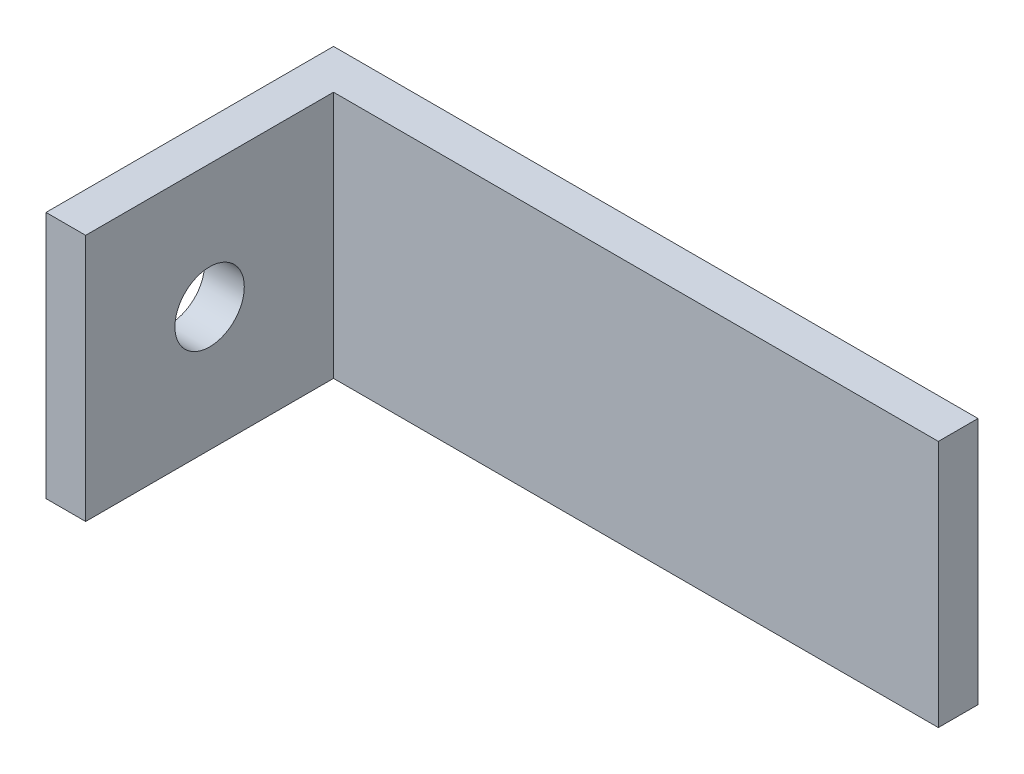
ISO-10303-21;
HEADER;
FILE_DESCRIPTION(('STEP AP214'),'2;1');
FILE_NAME('part.step','',(''),(''),'','','');
FILE_SCHEMA(('AUTOMOTIVE_DESIGN { 1 0 10303 214 1 1 1 1 }'));
ENDSEC;
DATA;
#1=APPLICATION_CONTEXT('core data for automotive mechanical design processes');
#2=APPLICATION_PROTOCOL_DEFINITION('international standard','automotive_design',2000,#1);
#3=PRODUCT_CONTEXT('',#1,'mechanical');
#4=PRODUCT('Part','Part','',(#3));
#5=PRODUCT_RELATED_PRODUCT_CATEGORY('part','',(#4));
#6=PRODUCT_DEFINITION_FORMATION('','',#4);
#7=PRODUCT_DEFINITION_CONTEXT('part definition',#1,'design');
#8=PRODUCT_DEFINITION('design','',#6,#7);
#9=PRODUCT_DEFINITION_SHAPE('','',#8);
#10=(LENGTH_UNIT() NAMED_UNIT(*) SI_UNIT(.MILLI.,.METRE.));
#11=(NAMED_UNIT(*) PLANE_ANGLE_UNIT() SI_UNIT($,.RADIAN.));
#12=(NAMED_UNIT(*) SI_UNIT($,.STERADIAN.) SOLID_ANGLE_UNIT());
#13=UNCERTAINTY_MEASURE_WITH_UNIT(LENGTH_MEASURE(1.E-05),#10,'distance_accuracy_value','');
#14=(GEOMETRIC_REPRESENTATION_CONTEXT(3) GLOBAL_UNCERTAINTY_ASSIGNED_CONTEXT((#13)) GLOBAL_UNIT_ASSIGNED_CONTEXT((#10,
#11,#12)) REPRESENTATION_CONTEXT('',''));
#15=CARTESIAN_POINT('',(0.,0.,0.));
#16=DIRECTION('',(0.,0.,1.));
#17=DIRECTION('',(1.,0.,0.));
#18=AXIS2_PLACEMENT_3D('',#15,#16,#17);
#19=CARTESIAN_POINT('',(-72.1437096238695,-24.4146296096291,2.));
#20=DIRECTION('',(1.,0.,0.));
#21=DIRECTION('',(0.,1.,0.));
#22=AXIS2_PLACEMENT_3D('',#19,#20,#21);
#23=PLANE('',#22);
#24=DIRECTION('',(0.,1.,0.));
#25=VECTOR('',#24,1.);
#26=CARTESIAN_POINT('',(-72.1437096238695,-48.8146296096291,-2.));
#27=LINE('',#26,#25);
#28=CARTESIAN_POINT('',(-72.1437096238695,-48.8146296096291,-2.));
#29=VERTEX_POINT('',#28);
#30=CARTESIAN_POINT('',(-72.1437096238695,-23.8146296096291,-2.));
#31=VERTEX_POINT('',#30);
#32=EDGE_CURVE('E90',#29,#31,#27,.T.);
#33=ORIENTED_EDGE('',*,*,#32,.F.);
#34=DIRECTION('',(0.,0.,-1.));
#35=VECTOR('',#34,1.);
#36=CARTESIAN_POINT('',(-72.1437096238695,-48.8146296096291,2.));
#37=LINE('',#36,#35);
#38=CARTESIAN_POINT('',(-72.1437096238695,-48.8146296096291,27.));
#39=VERTEX_POINT('',#38);
#40=EDGE_CURVE('E11',#39,#29,#37,.T.);
#41=ORIENTED_EDGE('',*,*,#40,.F.);
#42=DIRECTION('',(0.,-1.,0.));
#43=VECTOR('',#42,1.);
#44=CARTESIAN_POINT('',(-72.1437096238695,-24.4146296096291,27.));
#45=LINE('',#44,#43);
#46=CARTESIAN_POINT('',(-72.1437096238695,-23.8146296096291,27.));
#47=VERTEX_POINT('',#46);
#48=EDGE_CURVE('E127',#47,#39,#45,.T.);
#49=ORIENTED_EDGE('',*,*,#48,.F.);
#50=DIRECTION('',(0.,0.,-1.));
#51=VECTOR('',#50,1.);
#52=CARTESIAN_POINT('',(-72.1437096238695,-23.8146296096291,-2.));
#53=LINE('',#52,#51);
#54=EDGE_CURVE('E114',#47,#31,#53,.T.);
#55=ORIENTED_EDGE('',*,*,#54,.T.);
#56=EDGE_LOOP('',(#33,#41,#49,#55));
#57=FACE_BOUND('',#56,.T.);
#58=CARTESIAN_POINT('',(-72.1437096238695,-36.3146296096291,14.5));
#59=DIRECTION('',(1.,0.,0.));
#60=DIRECTION('',(0.,0.,-1.));
#61=AXIS2_PLACEMENT_3D('',#58,#59,#60);
#62=CIRCLE('',#61,3.5);
#63=CARTESIAN_POINT('',(-72.1437096238695,-36.3146296096291,11.));
#64=VERTEX_POINT('',#63);
#65=EDGE_CURVE('E111',#64,#64,#62,.T.);
#66=ORIENTED_EDGE('',*,*,#65,.T.);
#67=EDGE_LOOP('',(#66));
#68=FACE_BOUND('',#67,.T.);
#69=ADVANCED_FACE('F32',(#57,#68),#23,.F.);
#70=CARTESIAN_POINT('',(-72.1437096238695,-48.8146296096291,2.));
#71=DIRECTION('',(0.,1.,0.));
#72=DIRECTION('',(0.,0.,1.));
#73=AXIS2_PLACEMENT_3D('',#70,#71,#72);
#74=PLANE('',#73);
#75=DIRECTION('',(1.,0.,0.));
#76=VECTOR('',#75,1.);
#77=CARTESIAN_POINT('',(-72.1437096238695,-48.8146296096291,2.));
#78=LINE('',#77,#76);
#79=CARTESIAN_POINT('',(-68.1437096238695,-48.8146296096291,2.));
#80=VERTEX_POINT('',#79);
#81=CARTESIAN_POINT('',(-7.1437096238695,-48.8146296096291,2.));
#82=VERTEX_POINT('',#81);
#83=EDGE_CURVE('E40',#80,#82,#78,.T.);
#84=ORIENTED_EDGE('',*,*,#83,.F.);
#85=DIRECTION('',(0.,0.,-1.));
#86=VECTOR('',#85,1.);
#87=CARTESIAN_POINT('',(-68.1437096238695,-48.8146296096291,26.4));
#88=LINE('',#87,#86);
#89=CARTESIAN_POINT('',(-68.1437096238695,-48.8146296096291,27.));
#90=VERTEX_POINT('',#89);
#91=EDGE_CURVE('E141',#90,#80,#88,.T.);
#92=ORIENTED_EDGE('',*,*,#91,.F.);
#93=DIRECTION('',(1.,0.,0.));
#94=VECTOR('',#93,1.);
#95=CARTESIAN_POINT('',(-72.1437096238695,-48.8146296096291,27.));
#96=LINE('',#95,#94);
#97=EDGE_CURVE('E130',#39,#90,#96,.T.);
#98=ORIENTED_EDGE('',*,*,#97,.F.);
#99=ORIENTED_EDGE('',*,*,#40,.T.);
#100=DIRECTION('',(-1.,0.,0.));
#101=VECTOR('',#100,1.);
#102=CARTESIAN_POINT('',(-72.1437096238695,-48.8146296096291,-2.));
#103=LINE('',#102,#101);
#104=CARTESIAN_POINT('',(-7.1437096238695,-48.8146296096291,-2.));
#105=VERTEX_POINT('',#104);
#106=EDGE_CURVE('E82',#105,#29,#103,.T.);
#107=ORIENTED_EDGE('',*,*,#106,.F.);
#108=DIRECTION('',(0.,0.,-1.));
#109=VECTOR('',#108,1.);
#110=CARTESIAN_POINT('',(-7.1437096238695,-48.8146296096291,2.));
#111=LINE('',#110,#109);
#112=EDGE_CURVE('E86',#82,#105,#111,.T.);
#113=ORIENTED_EDGE('',*,*,#112,.F.);
#114=EDGE_LOOP('',(#84,#92,#98,#99,#107,#113));
#115=FACE_BOUND('',#114,.T.);
#116=ADVANCED_FACE('F84',(#115),#74,.F.);
#117=CARTESIAN_POINT('',(0.,0.,2.));
#118=DIRECTION('',(0.,0.,1.));
#119=DIRECTION('',(1.,0.,0.));
#120=AXIS2_PLACEMENT_3D('',#117,#118,#119);
#121=PLANE('',#120);
#122=DIRECTION('',(0.,1.,0.));
#123=VECTOR('',#122,1.);
#124=CARTESIAN_POINT('',(-68.1437096238695,-24.4146296096291,2.));
#125=LINE('',#124,#123);
#126=CARTESIAN_POINT('',(-68.1437096238695,-23.8146296096291,2.));
#127=VERTEX_POINT('',#126);
#128=EDGE_CURVE('E48',#80,#127,#125,.T.);
#129=ORIENTED_EDGE('',*,*,#128,.F.);
#130=ORIENTED_EDGE('',*,*,#83,.T.);
#131=DIRECTION('',(0.,-1.,0.));
#132=VECTOR('',#131,1.);
#133=CARTESIAN_POINT('',(-7.1437096238695,-48.8146296096291,2.));
#134=LINE('',#133,#132);
#135=CARTESIAN_POINT('',(-7.1437096238695,-23.8146296096291,2.));
#136=VERTEX_POINT('',#135);
#137=EDGE_CURVE('E105',#136,#82,#134,.T.);
#138=ORIENTED_EDGE('',*,*,#137,.F.);
#139=DIRECTION('',(-1.,0.,0.));
#140=VECTOR('',#139,1.);
#141=CARTESIAN_POINT('',(-68.1437096238695,-23.8146296096291,2.));
#142=LINE('',#141,#140);
#143=EDGE_CURVE('E119',#136,#127,#142,.T.);
#144=ORIENTED_EDGE('',*,*,#143,.T.);
#145=EDGE_LOOP('',(#129,#130,#138,#144));
#146=FACE_BOUND('',#145,.T.);
#147=ADVANCED_FACE('F145',(#146),#121,.T.);
#148=CARTESIAN_POINT('',(-68.1437096238695,-24.4146296096291,26.4));
#149=DIRECTION('',(-1.,0.,0.));
#150=DIRECTION('',(0.,0.,1.));
#151=AXIS2_PLACEMENT_3D('',#148,#149,#150);
#152=PLANE('',#151);
#153=CARTESIAN_POINT('',(-68.1437096238695,-36.3146296096291,14.5));
#154=DIRECTION('',(1.,0.,0.));
#155=DIRECTION('',(0.,0.,-1.));
#156=AXIS2_PLACEMENT_3D('',#153,#154,#155);
#157=CIRCLE('',#156,3.5);
#158=CARTESIAN_POINT('',(-68.1437096238695,-36.3146296096291,11.));
#159=VERTEX_POINT('',#158);
#160=EDGE_CURVE('E110',#159,#159,#157,.T.);
#161=ORIENTED_EDGE('',*,*,#160,.F.);
#162=EDGE_LOOP('',(#161));
#163=FACE_BOUND('',#162,.T.);
#164=ORIENTED_EDGE('',*,*,#128,.T.);
#165=DIRECTION('',(0.,0.,1.));
#166=VECTOR('',#165,1.);
#167=CARTESIAN_POINT('',(-68.1437096238695,-23.8146296096291,27.));
#168=LINE('',#167,#166);
#169=CARTESIAN_POINT('',(-68.1437096238695,-23.8146296096291,27.));
#170=VERTEX_POINT('',#169);
#171=EDGE_CURVE('E121',#127,#170,#168,.T.);
#172=ORIENTED_EDGE('',*,*,#171,.T.);
#173=DIRECTION('',(0.,1.,0.));
#174=VECTOR('',#173,1.);
#175=CARTESIAN_POINT('',(-68.1437096238695,-24.4146296096291,27.));
#176=LINE('',#175,#174);
#177=EDGE_CURVE('E133',#90,#170,#176,.T.);
#178=ORIENTED_EDGE('',*,*,#177,.F.);
#179=ORIENTED_EDGE('',*,*,#91,.T.);
#180=EDGE_LOOP('',(#164,#172,#178,#179));
#181=FACE_BOUND('',#180,.T.);
#182=ADVANCED_FACE('F148',(#163,#181),#152,.F.);
#183=CARTESIAN_POINT('',(0.,0.,-2.));
#184=DIRECTION('',(0.,0.,-1.));
#185=DIRECTION('',(-1.,0.,0.));
#186=AXIS2_PLACEMENT_3D('',#183,#184,#185);
#187=PLANE('',#186);
#188=ORIENTED_EDGE('',*,*,#32,.T.);
#189=DIRECTION('',(1.,0.,0.));
#190=VECTOR('',#189,1.);
#191=CARTESIAN_POINT('',(-14.3437096238695,-23.8146296096291,-2.));
#192=LINE('',#191,#190);
#193=CARTESIAN_POINT('',(-7.1437096238695,-23.8146296096291,-2.));
#194=VERTEX_POINT('',#193);
#195=EDGE_CURVE('E96',#31,#194,#192,.T.);
#196=ORIENTED_EDGE('',*,*,#195,.T.);
#197=DIRECTION('',(0.,1.,0.));
#198=VECTOR('',#197,1.);
#199=CARTESIAN_POINT('',(-7.1437096238695,-48.8146296096291,-2.));
#200=LINE('',#199,#198);
#201=EDGE_CURVE('E93',#105,#194,#200,.T.);
#202=ORIENTED_EDGE('',*,*,#201,.F.);
#203=ORIENTED_EDGE('',*,*,#106,.T.);
#204=EDGE_LOOP('',(#188,#196,#202,#203));
#205=FACE_BOUND('',#204,.T.);
#206=ADVANCED_FACE('F94',(#205),#187,.T.);
#207=CARTESIAN_POINT('',(0.,0.,27.));
#208=DIRECTION('',(0.,0.,1.));
#209=DIRECTION('',(1.,0.,0.));
#210=AXIS2_PLACEMENT_3D('',#207,#208,#209);
#211=PLANE('',#210);
#212=ORIENTED_EDGE('',*,*,#48,.T.);
#213=ORIENTED_EDGE('',*,*,#97,.T.);
#214=ORIENTED_EDGE('',*,*,#177,.T.);
#215=DIRECTION('',(-1.,0.,0.));
#216=VECTOR('',#215,1.);
#217=CARTESIAN_POINT('',(-72.1437096238695,-23.8146296096291,27.));
#218=LINE('',#217,#216);
#219=EDGE_CURVE('E124',#170,#47,#218,.T.);
#220=ORIENTED_EDGE('',*,*,#219,.T.);
#221=EDGE_LOOP('',(#212,#213,#214,#220));
#222=FACE_BOUND('',#221,.T.);
#223=ADVANCED_FACE('F147',(#222),#211,.T.);
#224=CARTESIAN_POINT('',(0.,-23.8146296096291,0.));
#225=DIRECTION('',(0.,1.,0.));
#226=DIRECTION('',(0.,0.,1.));
#227=AXIS2_PLACEMENT_3D('',#224,#225,#226);
#228=PLANE('',#227);
#229=ORIENTED_EDGE('',*,*,#195,.F.);
#230=ORIENTED_EDGE('',*,*,#54,.F.);
#231=ORIENTED_EDGE('',*,*,#219,.F.);
#232=ORIENTED_EDGE('',*,*,#171,.F.);
#233=ORIENTED_EDGE('',*,*,#143,.F.);
#234=DIRECTION('',(0.,0.,1.));
#235=VECTOR('',#234,1.);
#236=CARTESIAN_POINT('',(-7.1437096238695,-23.8146296096291,2.));
#237=LINE('',#236,#235);
#238=EDGE_CURVE('E100',#194,#136,#237,.T.);
#239=ORIENTED_EDGE('',*,*,#238,.F.);
#240=EDGE_LOOP('',(#229,#230,#231,#232,#233,#239));
#241=FACE_BOUND('',#240,.T.);
#242=ADVANCED_FACE('F153',(#241),#228,.T.);
#243=CARTESIAN_POINT('',(-72.1437096238695,-36.3146296096291,14.5));
#244=DIRECTION('',(1.,0.,0.));
#245=DIRECTION('',(0.,0.,-1.));
#246=AXIS2_PLACEMENT_3D('',#243,#244,#245);
#247=CYLINDRICAL_SURFACE('',#246,3.5);
#248=ORIENTED_EDGE('',*,*,#65,.F.);
#249=EDGE_LOOP('',(#248));
#250=FACE_BOUND('',#249,.T.);
#251=ORIENTED_EDGE('',*,*,#160,.T.);
#252=EDGE_LOOP('',(#251));
#253=FACE_BOUND('',#252,.T.);
#254=ADVANCED_FACE('F159',(#250,#253),#247,.F.);
#255=CARTESIAN_POINT('',(-7.1437096238695,0.,0.));
#256=DIRECTION('',(1.,0.,0.));
#257=DIRECTION('',(0.,0.,-1.));
#258=AXIS2_PLACEMENT_3D('',#255,#256,#257);
#259=PLANE('',#258);
#260=ORIENTED_EDGE('',*,*,#112,.T.);
#261=ORIENTED_EDGE('',*,*,#201,.T.);
#262=ORIENTED_EDGE('',*,*,#238,.T.);
#263=ORIENTED_EDGE('',*,*,#137,.T.);
#264=EDGE_LOOP('',(#260,#261,#262,#263));
#265=FACE_BOUND('',#264,.T.);
#266=ADVANCED_FACE('F103',(#265),#259,.T.);
#267=CLOSED_SHELL('',(#69,#116,#147,#182,#206,#223,#242,#254,#266));
#268=MANIFOLD_SOLID_BREP('B2',#267);
#269=ADVANCED_BREP_SHAPE_REPRESENTATION('',(#18,#268),#14);
#270=SHAPE_DEFINITION_REPRESENTATION(#9,#269);
ENDSEC;
END-ISO-10303-21;
